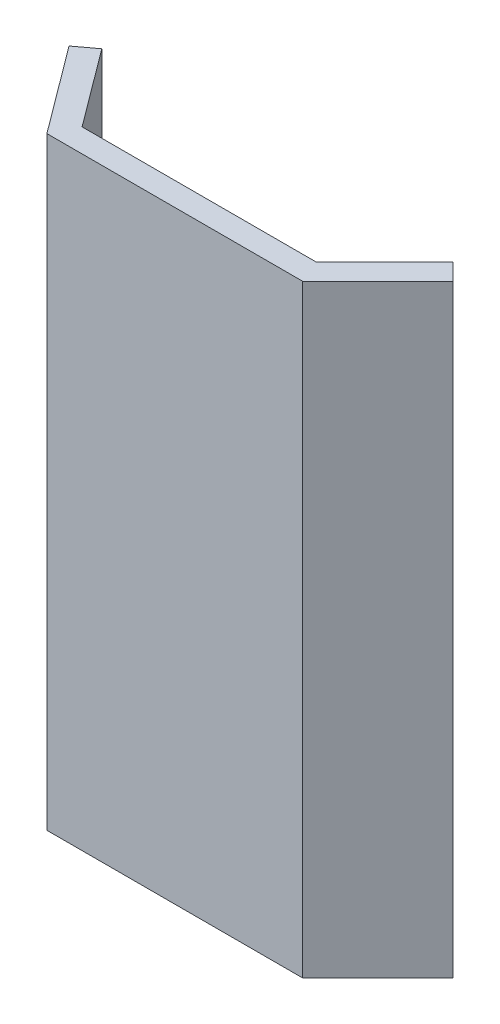
ISO-10303-21;
HEADER;
FILE_DESCRIPTION(('STEP AP214'),'2;1');
FILE_NAME('part.step','',(''),(''),'','','');
FILE_SCHEMA(('AUTOMOTIVE_DESIGN { 1 0 10303 214 1 1 1 1 }'));
ENDSEC;
DATA;
#1=APPLICATION_CONTEXT('core data for automotive mechanical design processes');
#2=APPLICATION_PROTOCOL_DEFINITION('international standard','automotive_design',2000,#1);
#3=PRODUCT_CONTEXT('',#1,'mechanical');
#4=PRODUCT('Part','Part','',(#3));
#5=PRODUCT_RELATED_PRODUCT_CATEGORY('part','',(#4));
#6=PRODUCT_DEFINITION_FORMATION('','',#4);
#7=PRODUCT_DEFINITION_CONTEXT('part definition',#1,'design');
#8=PRODUCT_DEFINITION('design','',#6,#7);
#9=PRODUCT_DEFINITION_SHAPE('','',#8);
#10=(LENGTH_UNIT() NAMED_UNIT(*) SI_UNIT(.MILLI.,.METRE.));
#11=(NAMED_UNIT(*) PLANE_ANGLE_UNIT() SI_UNIT($,.RADIAN.));
#12=(NAMED_UNIT(*) SI_UNIT($,.STERADIAN.) SOLID_ANGLE_UNIT());
#13=UNCERTAINTY_MEASURE_WITH_UNIT(LENGTH_MEASURE(1.E-05),#10,'distance_accuracy_value','');
#14=(GEOMETRIC_REPRESENTATION_CONTEXT(3) GLOBAL_UNCERTAINTY_ASSIGNED_CONTEXT((#13)) GLOBAL_UNIT_ASSIGNED_CONTEXT((#10,
#11,#12)) REPRESENTATION_CONTEXT('',''));
#15=CARTESIAN_POINT('',(0.,0.,0.));
#16=DIRECTION('',(0.,0.,1.));
#17=DIRECTION('',(1.,0.,0.));
#18=AXIS2_PLACEMENT_3D('',#15,#16,#17);
#19=CARTESIAN_POINT('',(-40.,103.,0.));
#20=DIRECTION('',(0.,0.,-1.));
#21=DIRECTION('',(-1.,0.,0.));
#22=AXIS2_PLACEMENT_3D('',#19,#20,#21);
#23=PLANE('',#22);
#24=DIRECTION('',(1.,0.,0.));
#25=VECTOR('',#24,1.);
#26=CARTESIAN_POINT('',(-40.,-103.,0.));
#27=LINE('',#26,#25);
#28=CARTESIAN_POINT('',(-40.,-103.,0.));
#29=VERTEX_POINT('',#28);
#30=CARTESIAN_POINT('',(40.,-103.,0.));
#31=VERTEX_POINT('',#30);
#32=EDGE_CURVE('E236',#29,#31,#27,.T.);
#33=ORIENTED_EDGE('',*,*,#32,.F.);
#34=DIRECTION('',(0.,-1.,0.));
#35=VECTOR('',#34,1.);
#36=CARTESIAN_POINT('',(-40.,103.,0.));
#37=LINE('',#36,#35);
#38=CARTESIAN_POINT('',(-40.,103.,0.));
#39=VERTEX_POINT('',#38);
#40=EDGE_CURVE('E257',#39,#29,#37,.T.);
#41=ORIENTED_EDGE('',*,*,#40,.F.);
#42=DIRECTION('',(1.,0.,0.));
#43=VECTOR('',#42,1.);
#44=CARTESIAN_POINT('',(-40.,103.,0.));
#45=LINE('',#44,#43);
#46=CARTESIAN_POINT('',(40.,103.,0.));
#47=VERTEX_POINT('',#46);
#48=EDGE_CURVE('E214',#39,#47,#45,.T.);
#49=ORIENTED_EDGE('',*,*,#48,.T.);
#50=DIRECTION('',(0.,-1.,0.));
#51=VECTOR('',#50,1.);
#52=CARTESIAN_POINT('',(40.,103.,0.));
#53=LINE('',#52,#51);
#54=EDGE_CURVE('E255',#47,#31,#53,.T.);
#55=ORIENTED_EDGE('',*,*,#54,.T.);
#56=EDGE_LOOP('',(#33,#41,#49,#55));
#57=FACE_BOUND('',#56,.T.);
#58=DIRECTION('',(-1.,0.,0.));
#59=VECTOR('',#58,1.);
#60=CARTESIAN_POINT('',(34.,-97.,0.));
#61=LINE('',#60,#59);
#62=CARTESIAN_POINT('',(34.,-97.,0.));
#63=VERTEX_POINT('',#62);
#64=CARTESIAN_POINT('',(24.,-97.,0.));
#65=VERTEX_POINT('',#64);
#66=EDGE_CURVE('E176',#63,#65,#61,.T.);
#67=ORIENTED_EDGE('',*,*,#66,.F.);
#68=DIRECTION('',(0.,-1.,0.));
#69=VECTOR('',#68,1.);
#70=CARTESIAN_POINT('',(34.,-97.,0.));
#71=LINE('',#70,#69);
#72=CARTESIAN_POINT('',(34.,-91.,0.));
#73=VERTEX_POINT('',#72);
#74=EDGE_CURVE('E173',#73,#63,#71,.T.);
#75=ORIENTED_EDGE('',*,*,#74,.F.);
#76=DIRECTION('',(1.,0.,0.));
#77=VECTOR('',#76,1.);
#78=CARTESIAN_POINT('',(34.,-91.,0.));
#79=LINE('',#78,#77);
#80=CARTESIAN_POINT('',(24.,-91.,0.));
#81=VERTEX_POINT('',#80);
#82=EDGE_CURVE('E185',#81,#73,#79,.T.);
#83=ORIENTED_EDGE('',*,*,#82,.F.);
#84=DIRECTION('',(0.,1.,0.));
#85=VECTOR('',#84,1.);
#86=CARTESIAN_POINT('',(24.,-97.,0.));
#87=LINE('',#86,#85);
#88=EDGE_CURVE('E193',#65,#81,#87,.T.);
#89=ORIENTED_EDGE('',*,*,#88,.F.);
#90=EDGE_LOOP('',(#67,#75,#83,#89));
#91=FACE_BOUND('',#90,.T.);
#92=DIRECTION('',(0.,1.,0.));
#93=VECTOR('',#92,1.);
#94=CARTESIAN_POINT('',(-34.,-97.,0.));
#95=LINE('',#94,#93);
#96=CARTESIAN_POINT('',(-34.,-97.,0.));
#97=VERTEX_POINT('',#96);
#98=CARTESIAN_POINT('',(-34.,-91.,0.));
#99=VERTEX_POINT('',#98);
#100=EDGE_CURVE('E266',#97,#99,#95,.T.);
#101=ORIENTED_EDGE('',*,*,#100,.F.);
#102=DIRECTION('',(-1.,0.,0.));
#103=VECTOR('',#102,1.);
#104=CARTESIAN_POINT('',(-34.,-97.,0.));
#105=LINE('',#104,#103);
#106=CARTESIAN_POINT('',(-24.,-97.,0.));
#107=VERTEX_POINT('',#106);
#108=EDGE_CURVE('E171',#107,#97,#105,.T.);
#109=ORIENTED_EDGE('',*,*,#108,.F.);
#110=DIRECTION('',(0.,-1.,0.));
#111=VECTOR('',#110,1.);
#112=CARTESIAN_POINT('',(-24.,-97.,0.));
#113=LINE('',#112,#111);
#114=CARTESIAN_POINT('',(-24.,-91.,0.));
#115=VERTEX_POINT('',#114);
#116=EDGE_CURVE('E167',#115,#107,#113,.T.);
#117=ORIENTED_EDGE('',*,*,#116,.F.);
#118=DIRECTION('',(1.,0.,0.));
#119=VECTOR('',#118,1.);
#120=CARTESIAN_POINT('',(-34.,-91.,0.));
#121=LINE('',#120,#119);
#122=EDGE_CURVE('E280',#99,#115,#121,.T.);
#123=ORIENTED_EDGE('',*,*,#122,.F.);
#124=EDGE_LOOP('',(#101,#109,#117,#123));
#125=FACE_BOUND('',#124,.T.);
#126=ADVANCED_FACE('F33',(#57,#91,#125),#23,.T.);
#127=CARTESIAN_POINT('',(-44.0155021652035,103.,8.));
#128=DIRECTION('',(-0.801854975467269,0.,0.597518701228995));
#129=DIRECTION('',(0.597518701228996,0.,0.801854975467269));
#130=AXIS2_PLACEMENT_3D('',#127,#128,#129);
#131=PLANE('',#130);
#132=DIRECTION('',(-0.597518701228996,0.,-0.801854975467269));
#133=VECTOR('',#132,1.);
#134=CARTESIAN_POINT('',(-44.0155021652035,-103.,8.));
#135=LINE('',#134,#133);
#136=CARTESIAN_POINT('',(-44.0155021652035,-103.,8.));
#137=VERTEX_POINT('',#136);
#138=CARTESIAN_POINT('',(-66.132956944295,-103.,-21.6810645805879));
#139=VERTEX_POINT('',#138);
#140=EDGE_CURVE('E204',#137,#139,#135,.T.);
#141=ORIENTED_EDGE('',*,*,#140,.F.);
#142=DIRECTION('',(0.,-1.,0.));
#143=VECTOR('',#142,1.);
#144=CARTESIAN_POINT('',(-44.0155021652035,103.,8.));
#145=LINE('',#144,#143);
#146=CARTESIAN_POINT('',(-44.0155021652035,103.,8.));
#147=VERTEX_POINT('',#146);
#148=EDGE_CURVE('E11',#147,#137,#145,.T.);
#149=ORIENTED_EDGE('',*,*,#148,.F.);
#150=DIRECTION('',(-0.597518701228996,0.,-0.801854975467269));
#151=VECTOR('',#150,1.);
#152=CARTESIAN_POINT('',(-44.0155021652035,103.,8.));
#153=LINE('',#152,#151);
#154=CARTESIAN_POINT('',(-66.132956944295,103.,-21.6810645805879));
#155=VERTEX_POINT('',#154);
#156=EDGE_CURVE('E205',#147,#155,#153,.T.);
#157=ORIENTED_EDGE('',*,*,#156,.T.);
#158=DIRECTION('',(0.,-1.,0.));
#159=VECTOR('',#158,1.);
#160=CARTESIAN_POINT('',(-66.132956944295,103.,-21.6810645805879));
#161=LINE('',#160,#159);
#162=EDGE_CURVE('E227',#155,#139,#161,.T.);
#163=ORIENTED_EDGE('',*,*,#162,.T.);
#164=EDGE_LOOP('',(#141,#149,#157,#163));
#165=FACE_BOUND('',#164,.T.);
#166=ADVANCED_FACE('F35',(#165),#131,.T.);
#167=CARTESIAN_POINT('',(-44.0155021652035,103.,8.));
#168=DIRECTION('',(0.,0.,-1.));
#169=DIRECTION('',(-1.,0.,0.));
#170=AXIS2_PLACEMENT_3D('',#167,#168,#169);
#171=PLANE('',#170);
#172=DIRECTION('',(1.,0.,0.));
#173=VECTOR('',#172,1.);
#174=CARTESIAN_POINT('',(-44.0155021652035,-103.,8.));
#175=LINE('',#174,#173);
#176=CARTESIAN_POINT('',(43.3137084989848,-103.,8.));
#177=VERTEX_POINT('',#176);
#178=EDGE_CURVE('E209',#137,#177,#175,.T.);
#179=ORIENTED_EDGE('',*,*,#178,.T.);
#180=DIRECTION('',(0.,-1.,0.));
#181=VECTOR('',#180,1.);
#182=CARTESIAN_POINT('',(43.3137084989848,103.,8.));
#183=LINE('',#182,#181);
#184=CARTESIAN_POINT('',(43.3137084989848,103.,8.));
#185=VERTEX_POINT('',#184);
#186=EDGE_CURVE('E42',#185,#177,#183,.T.);
#187=ORIENTED_EDGE('',*,*,#186,.F.);
#188=DIRECTION('',(1.,0.,0.));
#189=VECTOR('',#188,1.);
#190=CARTESIAN_POINT('',(-44.0155021652035,103.,8.));
#191=LINE('',#190,#189);
#192=EDGE_CURVE('E225',#147,#185,#191,.T.);
#193=ORIENTED_EDGE('',*,*,#192,.F.);
#194=ORIENTED_EDGE('',*,*,#148,.T.);
#195=EDGE_LOOP('',(#179,#187,#193,#194));
#196=FACE_BOUND('',#195,.T.);
#197=ADVANCED_FACE('F305',(#196),#171,.F.);
#198=CARTESIAN_POINT('',(43.3137084989848,103.,8.));
#199=DIRECTION('',(-0.707106781186548,0.,-0.707106781186548));
#200=DIRECTION('',(-0.707106781186548,0.,0.707106781186548));
#201=AXIS2_PLACEMENT_3D('',#198,#199,#200);
#202=PLANE('',#201);
#203=DIRECTION('',(0.707106781186548,0.,-0.707106781186548));
#204=VECTOR('',#203,1.);
#205=CARTESIAN_POINT('',(43.3137084989848,-103.,8.));
#206=LINE('',#205,#204);
#207=CARTESIAN_POINT('',(68.9913780286485,-103.,-17.6776695296637));
#208=VERTEX_POINT('',#207);
#209=EDGE_CURVE('E245',#177,#208,#206,.T.);
#210=ORIENTED_EDGE('',*,*,#209,.T.);
#211=DIRECTION('',(0.,-1.,0.));
#212=VECTOR('',#211,1.);
#213=CARTESIAN_POINT('',(68.9913780286485,103.,-17.6776695296637));
#214=LINE('',#213,#212);
#215=CARTESIAN_POINT('',(68.9913780286485,103.,-17.6776695296637));
#216=VERTEX_POINT('',#215);
#217=EDGE_CURVE('E251',#216,#208,#214,.T.);
#218=ORIENTED_EDGE('',*,*,#217,.F.);
#219=DIRECTION('',(0.707106781186548,0.,-0.707106781186548));
#220=VECTOR('',#219,1.);
#221=CARTESIAN_POINT('',(43.3137084989848,103.,8.));
#222=LINE('',#221,#220);
#223=EDGE_CURVE('E223',#185,#216,#222,.T.);
#224=ORIENTED_EDGE('',*,*,#223,.F.);
#225=ORIENTED_EDGE('',*,*,#186,.T.);
#226=EDGE_LOOP('',(#210,#218,#224,#225));
#227=FACE_BOUND('',#226,.T.);
#228=ADVANCED_FACE('F349',(#227),#202,.F.);
#229=CARTESIAN_POINT('',(63.3345237791561,103.,-23.3345237791561));
#230=DIRECTION('',(0.707106781186546,0.,-0.707106781186549));
#231=DIRECTION('',(-0.707106781186549,0.,-0.707106781186546));
#232=AXIS2_PLACEMENT_3D('',#229,#230,#231);
#233=PLANE('',#232);
#234=DIRECTION('',(0.707106781186549,0.,0.707106781186546));
#235=VECTOR('',#234,1.);
#236=CARTESIAN_POINT('',(63.3345237791561,-103.,-23.3345237791561));
#237=LINE('',#236,#235);
#238=CARTESIAN_POINT('',(63.3345237791561,-103.,-23.3345237791561));
#239=VERTEX_POINT('',#238);
#240=EDGE_CURVE('E242',#239,#208,#237,.T.);
#241=ORIENTED_EDGE('',*,*,#240,.F.);
#242=DIRECTION('',(0.,-1.,0.));
#243=VECTOR('',#242,1.);
#244=CARTESIAN_POINT('',(63.3345237791561,103.,-23.3345237791561));
#245=LINE('',#244,#243);
#246=CARTESIAN_POINT('',(63.3345237791561,103.,-23.3345237791561));
#247=VERTEX_POINT('',#246);
#248=EDGE_CURVE('E253',#247,#239,#245,.T.);
#249=ORIENTED_EDGE('',*,*,#248,.F.);
#250=DIRECTION('',(0.707106781186549,0.,0.707106781186546));
#251=VECTOR('',#250,1.);
#252=CARTESIAN_POINT('',(63.3345237791561,103.,-23.3345237791561));
#253=LINE('',#252,#251);
#254=EDGE_CURVE('E220',#247,#216,#253,.T.);
#255=ORIENTED_EDGE('',*,*,#254,.T.);
#256=ORIENTED_EDGE('',*,*,#217,.T.);
#257=EDGE_LOOP('',(#241,#249,#255,#256));
#258=FACE_BOUND('',#257,.T.);
#259=ADVANCED_FACE('F344',(#258),#233,.T.);
#260=CARTESIAN_POINT('',(40.,103.,0.));
#261=DIRECTION('',(-0.707106781186547,0.,-0.707106781186548));
#262=DIRECTION('',(-0.707106781186548,0.,0.707106781186547));
#263=AXIS2_PLACEMENT_3D('',#260,#261,#262);
#264=PLANE('',#263);
#265=DIRECTION('',(0.707106781186548,0.,-0.707106781186547));
#266=VECTOR('',#265,1.);
#267=CARTESIAN_POINT('',(40.,-103.,0.));
#268=LINE('',#267,#266);
#269=EDGE_CURVE('E239',#31,#239,#268,.T.);
#270=ORIENTED_EDGE('',*,*,#269,.F.);
#271=ORIENTED_EDGE('',*,*,#54,.F.);
#272=DIRECTION('',(0.707106781186548,0.,-0.707106781186547));
#273=VECTOR('',#272,1.);
#274=CARTESIAN_POINT('',(40.,103.,0.));
#275=LINE('',#274,#273);
#276=EDGE_CURVE('E217',#47,#247,#275,.T.);
#277=ORIENTED_EDGE('',*,*,#276,.T.);
#278=ORIENTED_EDGE('',*,*,#248,.T.);
#279=EDGE_LOOP('',(#270,#271,#277,#278));
#280=FACE_BOUND('',#279,.T.);
#281=ADVANCED_FACE('F311',(#280),#264,.T.);
#282=CARTESIAN_POINT('',(-40.,103.,0.));
#283=DIRECTION('',(-0.801854975467269,0.,0.597518701228996));
#284=DIRECTION('',(0.597518701228996,0.,0.801854975467269));
#285=AXIS2_PLACEMENT_3D('',#282,#283,#284);
#286=PLANE('',#285);
#287=DIRECTION('',(-0.597518701228996,0.,-0.801854975467269));
#288=VECTOR('',#287,1.);
#289=CARTESIAN_POINT('',(-40.,-103.,0.));
#290=LINE('',#289,#288);
#291=CARTESIAN_POINT('',(-59.7181171405569,-103.,-26.4612141904199));
#292=VERTEX_POINT('',#291);
#293=EDGE_CURVE('E233',#29,#292,#290,.T.);
#294=ORIENTED_EDGE('',*,*,#293,.T.);
#295=DIRECTION('',(0.,-1.,0.));
#296=VECTOR('',#295,1.);
#297=CARTESIAN_POINT('',(-59.7181171405569,103.,-26.4612141904199));
#298=LINE('',#297,#296);
#299=CARTESIAN_POINT('',(-59.7181171405569,103.,-26.4612141904199));
#300=VERTEX_POINT('',#299);
#301=EDGE_CURVE('E259',#300,#292,#298,.T.);
#302=ORIENTED_EDGE('',*,*,#301,.F.);
#303=DIRECTION('',(-0.597518701228996,0.,-0.801854975467269));
#304=VECTOR('',#303,1.);
#305=CARTESIAN_POINT('',(-40.,103.,0.));
#306=LINE('',#305,#304);
#307=EDGE_CURVE('E212',#39,#300,#306,.T.);
#308=ORIENTED_EDGE('',*,*,#307,.F.);
#309=ORIENTED_EDGE('',*,*,#40,.T.);
#310=EDGE_LOOP('',(#294,#302,#308,#309));
#311=FACE_BOUND('',#310,.T.);
#312=ADVANCED_FACE('F313',(#311),#286,.F.);
#313=CARTESIAN_POINT('',(-66.132956944295,103.,-21.6810645805879));
#314=DIRECTION('',(-0.597518701228995,0.,-0.801854975467269));
#315=DIRECTION('',(-0.801854975467269,0.,0.597518701228995));
#316=AXIS2_PLACEMENT_3D('',#313,#314,#315);
#317=PLANE('',#316);
#318=DIRECTION('',(0.801854975467269,0.,-0.597518701228995));
#319=VECTOR('',#318,1.);
#320=CARTESIAN_POINT('',(-66.132956944295,-103.,-21.6810645805879));
#321=LINE('',#320,#319);
#322=EDGE_CURVE('E230',#139,#292,#321,.T.);
#323=ORIENTED_EDGE('',*,*,#322,.F.);
#324=ORIENTED_EDGE('',*,*,#162,.F.);
#325=DIRECTION('',(0.801854975467269,0.,-0.597518701228995));
#326=VECTOR('',#325,1.);
#327=CARTESIAN_POINT('',(-66.132956944295,103.,-21.6810645805879));
#328=LINE('',#327,#326);
#329=EDGE_CURVE('E208',#155,#300,#328,.T.);
#330=ORIENTED_EDGE('',*,*,#329,.T.);
#331=ORIENTED_EDGE('',*,*,#301,.T.);
#332=EDGE_LOOP('',(#323,#324,#330,#331));
#333=FACE_BOUND('',#332,.T.);
#334=ADVANCED_FACE('F315',(#333),#317,.T.);
#335=CARTESIAN_POINT('',(0.,103.,0.));
#336=DIRECTION('',(0.,-1.,0.));
#337=DIRECTION('',(0.,0.,-1.));
#338=AXIS2_PLACEMENT_3D('',#335,#336,#337);
#339=PLANE('',#338);
#340=ORIENTED_EDGE('',*,*,#156,.F.);
#341=ORIENTED_EDGE('',*,*,#192,.T.);
#342=ORIENTED_EDGE('',*,*,#223,.T.);
#343=ORIENTED_EDGE('',*,*,#254,.F.);
#344=ORIENTED_EDGE('',*,*,#276,.F.);
#345=ORIENTED_EDGE('',*,*,#48,.F.);
#346=ORIENTED_EDGE('',*,*,#307,.T.);
#347=ORIENTED_EDGE('',*,*,#329,.F.);
#348=EDGE_LOOP('',(#340,#341,#342,#343,#344,#345,#346,#347));
#349=FACE_BOUND('',#348,.T.);
#350=ADVANCED_FACE('F318',(#349),#339,.F.);
#351=CARTESIAN_POINT('',(0.,-103.,0.));
#352=DIRECTION('',(0.,-1.,0.));
#353=DIRECTION('',(0.,0.,-1.));
#354=AXIS2_PLACEMENT_3D('',#351,#352,#353);
#355=PLANE('',#354);
#356=ORIENTED_EDGE('',*,*,#140,.T.);
#357=ORIENTED_EDGE('',*,*,#322,.T.);
#358=ORIENTED_EDGE('',*,*,#293,.F.);
#359=ORIENTED_EDGE('',*,*,#32,.T.);
#360=ORIENTED_EDGE('',*,*,#269,.T.);
#361=ORIENTED_EDGE('',*,*,#240,.T.);
#362=ORIENTED_EDGE('',*,*,#209,.F.);
#363=ORIENTED_EDGE('',*,*,#178,.F.);
#364=EDGE_LOOP('',(#356,#357,#358,#359,#360,#361,#362,#363));
#365=FACE_BOUND('',#364,.T.);
#366=ADVANCED_FACE('F323',(#365),#355,.T.);
#367=CARTESIAN_POINT('',(34.,-97.,-10.));
#368=DIRECTION('',(-1.,0.,0.));
#369=DIRECTION('',(0.,0.,1.));
#370=AXIS2_PLACEMENT_3D('',#367,#368,#369);
#371=PLANE('',#370);
#372=ORIENTED_EDGE('',*,*,#74,.T.);
#373=DIRECTION('',(0.,0.,1.));
#374=VECTOR('',#373,1.);
#375=CARTESIAN_POINT('',(34.,-97.,-10.));
#376=LINE('',#375,#374);
#377=CARTESIAN_POINT('',(34.,-97.,-10.));
#378=VERTEX_POINT('',#377);
#379=EDGE_CURVE('E202',#378,#63,#376,.T.);
#380=ORIENTED_EDGE('',*,*,#379,.F.);
#381=DIRECTION('',(0.,-1.,0.));
#382=VECTOR('',#381,1.);
#383=CARTESIAN_POINT('',(34.,-97.,-10.));
#384=LINE('',#383,#382);
#385=CARTESIAN_POINT('',(34.,-91.,-10.));
#386=VERTEX_POINT('',#385);
#387=EDGE_CURVE('E181',#386,#378,#384,.T.);
#388=ORIENTED_EDGE('',*,*,#387,.F.);
#389=DIRECTION('',(0.,0.,1.));
#390=VECTOR('',#389,1.);
#391=CARTESIAN_POINT('',(34.,-91.,-10.));
#392=LINE('',#391,#390);
#393=EDGE_CURVE('E190',#386,#73,#392,.T.);
#394=ORIENTED_EDGE('',*,*,#393,.T.);
#395=EDGE_LOOP('',(#372,#380,#388,#394));
#396=FACE_BOUND('',#395,.T.);
#397=ADVANCED_FACE('F386',(#396),#371,.F.);
#398=CARTESIAN_POINT('',(34.,-97.,-10.));
#399=DIRECTION('',(0.,1.,0.));
#400=DIRECTION('',(0.,0.,1.));
#401=AXIS2_PLACEMENT_3D('',#398,#399,#400);
#402=PLANE('',#401);
#403=CARTESIAN_POINT('',(29.,-97.,-5.));
#404=DIRECTION('',(0.,-1.,0.));
#405=DIRECTION('',(0.,0.,-1.));
#406=AXIS2_PLACEMENT_3D('',#403,#404,#405);
#407=CIRCLE('',#406,1.5);
#408=CARTESIAN_POINT('',(29.,-97.,-6.5));
#409=VERTEX_POINT('',#408);
#410=EDGE_CURVE('E263',#409,#409,#407,.T.);
#411=ORIENTED_EDGE('',*,*,#410,.F.);
#412=EDGE_LOOP('',(#411));
#413=FACE_BOUND('',#412,.T.);
#414=ORIENTED_EDGE('',*,*,#66,.T.);
#415=DIRECTION('',(0.,0.,1.));
#416=VECTOR('',#415,1.);
#417=CARTESIAN_POINT('',(24.,-97.,-10.));
#418=LINE('',#417,#416);
#419=CARTESIAN_POINT('',(24.,-97.,-10.));
#420=VERTEX_POINT('',#419);
#421=EDGE_CURVE('E199',#420,#65,#418,.T.);
#422=ORIENTED_EDGE('',*,*,#421,.F.);
#423=DIRECTION('',(-1.,0.,0.));
#424=VECTOR('',#423,1.);
#425=CARTESIAN_POINT('',(34.,-97.,-10.));
#426=LINE('',#425,#424);
#427=EDGE_CURVE('E184',#378,#420,#426,.T.);
#428=ORIENTED_EDGE('',*,*,#427,.F.);
#429=ORIENTED_EDGE('',*,*,#379,.T.);
#430=EDGE_LOOP('',(#414,#422,#428,#429));
#431=FACE_BOUND('',#430,.T.);
#432=ADVANCED_FACE('F399',(#413,#431),#402,.F.);
#433=CARTESIAN_POINT('',(24.,-97.,-10.));
#434=DIRECTION('',(1.,0.,0.));
#435=DIRECTION('',(0.,0.,-1.));
#436=AXIS2_PLACEMENT_3D('',#433,#434,#435);
#437=PLANE('',#436);
#438=ORIENTED_EDGE('',*,*,#88,.T.);
#439=DIRECTION('',(0.,0.,1.));
#440=VECTOR('',#439,1.);
#441=CARTESIAN_POINT('',(24.,-91.,-10.));
#442=LINE('',#441,#440);
#443=CARTESIAN_POINT('',(24.,-91.,-10.));
#444=VERTEX_POINT('',#443);
#445=EDGE_CURVE('E58',#444,#81,#442,.T.);
#446=ORIENTED_EDGE('',*,*,#445,.F.);
#447=DIRECTION('',(0.,1.,0.));
#448=VECTOR('',#447,1.);
#449=CARTESIAN_POINT('',(24.,-97.,-10.));
#450=LINE('',#449,#448);
#451=EDGE_CURVE('E187',#420,#444,#450,.T.);
#452=ORIENTED_EDGE('',*,*,#451,.F.);
#453=ORIENTED_EDGE('',*,*,#421,.T.);
#454=EDGE_LOOP('',(#438,#446,#452,#453));
#455=FACE_BOUND('',#454,.T.);
#456=ADVANCED_FACE('F407',(#455),#437,.F.);
#457=CARTESIAN_POINT('',(34.,-91.,-10.));
#458=DIRECTION('',(0.,-1.,0.));
#459=DIRECTION('',(0.,0.,-1.));
#460=AXIS2_PLACEMENT_3D('',#457,#458,#459);
#461=PLANE('',#460);
#462=CARTESIAN_POINT('',(29.,-91.,-5.));
#463=DIRECTION('',(0.,-1.,0.));
#464=DIRECTION('',(0.,0.,-1.));
#465=AXIS2_PLACEMENT_3D('',#462,#463,#464);
#466=CIRCLE('',#465,1.5);
#467=CARTESIAN_POINT('',(29.,-91.,-6.5));
#468=VERTEX_POINT('',#467);
#469=EDGE_CURVE('E261',#468,#468,#466,.T.);
#470=ORIENTED_EDGE('',*,*,#469,.T.);
#471=EDGE_LOOP('',(#470));
#472=FACE_BOUND('',#471,.T.);
#473=ORIENTED_EDGE('',*,*,#82,.T.);
#474=ORIENTED_EDGE('',*,*,#393,.F.);
#475=DIRECTION('',(1.,0.,0.));
#476=VECTOR('',#475,1.);
#477=CARTESIAN_POINT('',(34.,-91.,-10.));
#478=LINE('',#477,#476);
#479=EDGE_CURVE('E189',#444,#386,#478,.T.);
#480=ORIENTED_EDGE('',*,*,#479,.F.);
#481=ORIENTED_EDGE('',*,*,#445,.T.);
#482=EDGE_LOOP('',(#473,#474,#480,#481));
#483=FACE_BOUND('',#482,.T.);
#484=ADVANCED_FACE('F412',(#472,#483),#461,.F.);
#485=CARTESIAN_POINT('',(0.,0.,-10.));
#486=DIRECTION('',(0.,0.,1.));
#487=DIRECTION('',(1.,0.,0.));
#488=AXIS2_PLACEMENT_3D('',#485,#486,#487);
#489=PLANE('',#488);
#490=ORIENTED_EDGE('',*,*,#387,.T.);
#491=ORIENTED_EDGE('',*,*,#427,.T.);
#492=ORIENTED_EDGE('',*,*,#451,.T.);
#493=ORIENTED_EDGE('',*,*,#479,.T.);
#494=EDGE_LOOP('',(#490,#491,#492,#493));
#495=FACE_BOUND('',#494,.T.);
#496=ADVANCED_FACE('F420',(#495),#489,.F.);
#497=CARTESIAN_POINT('',(-34.,-97.,-10.));
#498=DIRECTION('',(0.,1.,0.));
#499=DIRECTION('',(0.,0.,1.));
#500=AXIS2_PLACEMENT_3D('',#497,#498,#499);
#501=PLANE('',#500);
#502=CARTESIAN_POINT('',(-29.,-97.,-5.));
#503=DIRECTION('',(0.,-1.,0.));
#504=DIRECTION('',(0.,0.,-1.));
#505=AXIS2_PLACEMENT_3D('',#502,#503,#504);
#506=CIRCLE('',#505,1.5);
#507=CARTESIAN_POINT('',(-29.,-97.,-6.5));
#508=VERTEX_POINT('',#507);
#509=EDGE_CURVE('E273',#508,#508,#506,.T.);
#510=ORIENTED_EDGE('',*,*,#509,.F.);
#511=EDGE_LOOP('',(#510));
#512=FACE_BOUND('',#511,.T.);
#513=ORIENTED_EDGE('',*,*,#108,.T.);
#514=DIRECTION('',(0.,0.,1.));
#515=VECTOR('',#514,1.);
#516=CARTESIAN_POINT('',(-34.,-97.,-10.));
#517=LINE('',#516,#515);
#518=CARTESIAN_POINT('',(-34.,-97.,-10.));
#519=VERTEX_POINT('',#518);
#520=EDGE_CURVE('E152',#519,#97,#517,.T.);
#521=ORIENTED_EDGE('',*,*,#520,.F.);
#522=DIRECTION('',(-1.,0.,0.));
#523=VECTOR('',#522,1.);
#524=CARTESIAN_POINT('',(-34.,-97.,-10.));
#525=LINE('',#524,#523);
#526=CARTESIAN_POINT('',(-24.,-97.,-10.));
#527=VERTEX_POINT('',#526);
#528=EDGE_CURVE('E159',#527,#519,#525,.T.);
#529=ORIENTED_EDGE('',*,*,#528,.F.);
#530=DIRECTION('',(0.,0.,1.));
#531=VECTOR('',#530,1.);
#532=CARTESIAN_POINT('',(-24.,-97.,-10.));
#533=LINE('',#532,#531);
#534=EDGE_CURVE('E277',#527,#107,#533,.T.);
#535=ORIENTED_EDGE('',*,*,#534,.T.);
#536=EDGE_LOOP('',(#513,#521,#529,#535));
#537=FACE_BOUND('',#536,.T.);
#538=ADVANCED_FACE('F169',(#512,#537),#501,.F.);
#539=CARTESIAN_POINT('',(-34.,-97.,-10.));
#540=DIRECTION('',(1.,0.,0.));
#541=DIRECTION('',(0.,0.,-1.));
#542=AXIS2_PLACEMENT_3D('',#539,#540,#541);
#543=PLANE('',#542);
#544=ORIENTED_EDGE('',*,*,#100,.T.);
#545=DIRECTION('',(0.,0.,1.));
#546=VECTOR('',#545,1.);
#547=CARTESIAN_POINT('',(-34.,-91.,-10.));
#548=LINE('',#547,#546);
#549=CARTESIAN_POINT('',(-34.,-91.,-10.));
#550=VERTEX_POINT('',#549);
#551=EDGE_CURVE('E155',#550,#99,#548,.T.);
#552=ORIENTED_EDGE('',*,*,#551,.F.);
#553=DIRECTION('',(0.,1.,0.));
#554=VECTOR('',#553,1.);
#555=CARTESIAN_POINT('',(-34.,-97.,-10.));
#556=LINE('',#555,#554);
#557=EDGE_CURVE('E148',#519,#550,#556,.T.);
#558=ORIENTED_EDGE('',*,*,#557,.F.);
#559=ORIENTED_EDGE('',*,*,#520,.T.);
#560=EDGE_LOOP('',(#544,#552,#558,#559));
#561=FACE_BOUND('',#560,.T.);
#562=ADVANCED_FACE('F150',(#561),#543,.F.);
#563=CARTESIAN_POINT('',(-34.,-91.,-10.));
#564=DIRECTION('',(0.,-1.,0.));
#565=DIRECTION('',(0.,0.,-1.));
#566=AXIS2_PLACEMENT_3D('',#563,#564,#565);
#567=PLANE('',#566);
#568=CARTESIAN_POINT('',(-29.,-91.,-5.));
#569=DIRECTION('',(0.,-1.,0.));
#570=DIRECTION('',(0.,0.,-1.));
#571=AXIS2_PLACEMENT_3D('',#568,#569,#570);
#572=CIRCLE('',#571,1.5);
#573=CARTESIAN_POINT('',(-29.,-91.,-6.5));
#574=VERTEX_POINT('',#573);
#575=EDGE_CURVE('E37',#574,#574,#572,.T.);
#576=ORIENTED_EDGE('',*,*,#575,.T.);
#577=EDGE_LOOP('',(#576));
#578=FACE_BOUND('',#577,.T.);
#579=ORIENTED_EDGE('',*,*,#122,.T.);
#580=DIRECTION('',(0.,0.,1.));
#581=VECTOR('',#580,1.);
#582=CARTESIAN_POINT('',(-24.,-91.,-10.));
#583=LINE('',#582,#581);
#584=CARTESIAN_POINT('',(-24.,-91.,-10.));
#585=VERTEX_POINT('',#584);
#586=EDGE_CURVE('E50',#585,#115,#583,.T.);
#587=ORIENTED_EDGE('',*,*,#586,.F.);
#588=DIRECTION('',(1.,0.,0.));
#589=VECTOR('',#588,1.);
#590=CARTESIAN_POINT('',(-34.,-91.,-10.));
#591=LINE('',#590,#589);
#592=EDGE_CURVE('E158',#550,#585,#591,.T.);
#593=ORIENTED_EDGE('',*,*,#592,.F.);
#594=ORIENTED_EDGE('',*,*,#551,.T.);
#595=EDGE_LOOP('',(#579,#587,#593,#594));
#596=FACE_BOUND('',#595,.T.);
#597=ADVANCED_FACE('F287',(#578,#596),#567,.F.);
#598=CARTESIAN_POINT('',(-24.,-97.,-10.));
#599=DIRECTION('',(-1.,0.,0.));
#600=DIRECTION('',(0.,0.,1.));
#601=AXIS2_PLACEMENT_3D('',#598,#599,#600);
#602=PLANE('',#601);
#603=ORIENTED_EDGE('',*,*,#116,.T.);
#604=ORIENTED_EDGE('',*,*,#534,.F.);
#605=DIRECTION('',(0.,-1.,0.));
#606=VECTOR('',#605,1.);
#607=CARTESIAN_POINT('',(-24.,-97.,-10.));
#608=LINE('',#607,#606);
#609=EDGE_CURVE('E163',#585,#527,#608,.T.);
#610=ORIENTED_EDGE('',*,*,#609,.F.);
#611=ORIENTED_EDGE('',*,*,#586,.T.);
#612=EDGE_LOOP('',(#603,#604,#610,#611));
#613=FACE_BOUND('',#612,.T.);
#614=ADVANCED_FACE('F288',(#613),#602,.F.);
#615=CARTESIAN_POINT('',(0.,0.,-10.));
#616=DIRECTION('',(0.,0.,1.));
#617=DIRECTION('',(1.,0.,0.));
#618=AXIS2_PLACEMENT_3D('',#615,#616,#617);
#619=PLANE('',#618);
#620=ORIENTED_EDGE('',*,*,#528,.T.);
#621=ORIENTED_EDGE('',*,*,#557,.T.);
#622=ORIENTED_EDGE('',*,*,#592,.T.);
#623=ORIENTED_EDGE('',*,*,#609,.T.);
#624=EDGE_LOOP('',(#620,#621,#622,#623));
#625=FACE_BOUND('',#624,.T.);
#626=ADVANCED_FACE('F162',(#625),#619,.F.);
#627=CARTESIAN_POINT('',(29.,103.,-5.));
#628=DIRECTION('',(0.,-1.,0.));
#629=DIRECTION('',(0.,0.,-1.));
#630=AXIS2_PLACEMENT_3D('',#627,#628,#629);
#631=CYLINDRICAL_SURFACE('',#630,1.5);
#632=ORIENTED_EDGE('',*,*,#410,.T.);
#633=EDGE_LOOP('',(#632));
#634=FACE_BOUND('',#633,.T.);
#635=ORIENTED_EDGE('',*,*,#469,.F.);
#636=EDGE_LOOP('',(#635));
#637=FACE_BOUND('',#636,.T.);
#638=ADVANCED_FACE('F295',(#634,#637),#631,.F.);
#639=CARTESIAN_POINT('',(-29.,103.,-5.));
#640=DIRECTION('',(0.,-1.,0.));
#641=DIRECTION('',(0.,0.,-1.));
#642=AXIS2_PLACEMENT_3D('',#639,#640,#641);
#643=CYLINDRICAL_SURFACE('',#642,1.5);
#644=ORIENTED_EDGE('',*,*,#509,.T.);
#645=EDGE_LOOP('',(#644));
#646=FACE_BOUND('',#645,.T.);
#647=ORIENTED_EDGE('',*,*,#575,.F.);
#648=EDGE_LOOP('',(#647));
#649=FACE_BOUND('',#648,.T.);
#650=ADVANCED_FACE('F480',(#646,#649),#643,.F.);
#651=CLOSED_SHELL('',(#126,#166,#197,#228,#259,#281,#312,#334,#350,#366,#397,#432,#456,#484,
#496,#538,#562,#597,#614,#626,#638,#650));
#652=MANIFOLD_SOLID_BREP('B2',#651);
#653=ADVANCED_BREP_SHAPE_REPRESENTATION('',(#18,#652),#14);
#654=SHAPE_DEFINITION_REPRESENTATION(#9,#653);
ENDSEC;
END-ISO-10303-21;
